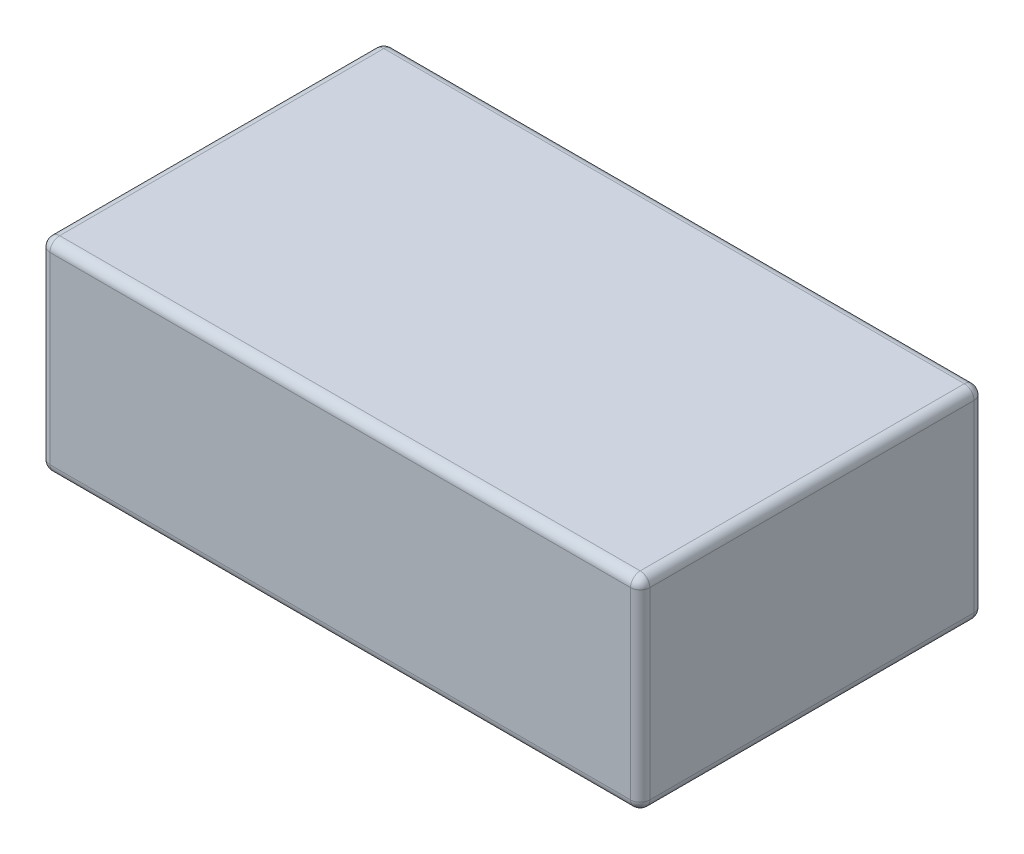
ISO-10303-21;
HEADER;
FILE_DESCRIPTION(('STEP AP214'),'2;1');
FILE_NAME('part.step','',(''),(''),'','','');
FILE_SCHEMA(('AUTOMOTIVE_DESIGN { 1 0 10303 214 1 1 1 1 }'));
ENDSEC;
DATA;
#1=APPLICATION_CONTEXT('core data for automotive mechanical design processes');
#2=APPLICATION_PROTOCOL_DEFINITION('international standard','automotive_design',2000,#1);
#3=PRODUCT_CONTEXT('',#1,'mechanical');
#4=PRODUCT('Part','Part','',(#3));
#5=PRODUCT_RELATED_PRODUCT_CATEGORY('part','',(#4));
#6=PRODUCT_DEFINITION_FORMATION('','',#4);
#7=PRODUCT_DEFINITION_CONTEXT('part definition',#1,'design');
#8=PRODUCT_DEFINITION('design','',#6,#7);
#9=PRODUCT_DEFINITION_SHAPE('','',#8);
#10=(LENGTH_UNIT() NAMED_UNIT(*) SI_UNIT(.MILLI.,.METRE.));
#11=(NAMED_UNIT(*) PLANE_ANGLE_UNIT() SI_UNIT($,.RADIAN.));
#12=(NAMED_UNIT(*) SI_UNIT($,.STERADIAN.) SOLID_ANGLE_UNIT());
#13=UNCERTAINTY_MEASURE_WITH_UNIT(LENGTH_MEASURE(1.E-05),#10,'distance_accuracy_value','');
#14=(GEOMETRIC_REPRESENTATION_CONTEXT(3) GLOBAL_UNCERTAINTY_ASSIGNED_CONTEXT((#13)) GLOBAL_UNIT_ASSIGNED_CONTEXT((#10,
#11,#12)) REPRESENTATION_CONTEXT('',''));
#15=CARTESIAN_POINT('',(0.,0.,0.));
#16=DIRECTION('',(0.,0.,1.));
#17=DIRECTION('',(1.,0.,0.));
#18=AXIS2_PLACEMENT_3D('',#15,#16,#17);
#19=CARTESIAN_POINT('',(-62.,42.,35.5));
#20=DIRECTION('',(1.,0.,0.));
#21=DIRECTION('',(0.,0.,-1.));
#22=AXIS2_PLACEMENT_3D('',#19,#20,#21);
#23=PLANE('',#22);
#24=DIRECTION('',(0.,-1.,0.));
#25=VECTOR('',#24,1.);
#26=CARTESIAN_POINT('',(-62.,42.,-33.5));
#27=LINE('',#26,#25);
#28=CARTESIAN_POINT('',(-62.,40.,-33.5));
#29=VERTEX_POINT('',#28);
#30=CARTESIAN_POINT('',(-62.,2.,-33.5));
#31=VERTEX_POINT('',#30);
#32=EDGE_CURVE('E164',#29,#31,#27,.T.);
#33=ORIENTED_EDGE('',*,*,#32,.T.);
#34=DIRECTION('',(0.,0.,1.));
#35=VECTOR('',#34,1.);
#36=CARTESIAN_POINT('',(-62.,2.,35.5));
#37=LINE('',#36,#35);
#38=CARTESIAN_POINT('',(-62.,2.,33.5));
#39=VERTEX_POINT('',#38);
#40=EDGE_CURVE('E138',#31,#39,#37,.T.);
#41=ORIENTED_EDGE('',*,*,#40,.T.);
#42=DIRECTION('',(0.,-1.,0.));
#43=VECTOR('',#42,1.);
#44=CARTESIAN_POINT('',(-62.,42.,33.5));
#45=LINE('',#44,#43);
#46=CARTESIAN_POINT('',(-62.,40.,33.5));
#47=VERTEX_POINT('',#46);
#48=EDGE_CURVE('E154',#39,#47,#45,.F.);
#49=ORIENTED_EDGE('',*,*,#48,.T.);
#50=DIRECTION('',(0.,0.,1.));
#51=VECTOR('',#50,1.);
#52=CARTESIAN_POINT('',(-62.,40.,-35.5));
#53=LINE('',#52,#51);
#54=EDGE_CURVE('E161',#47,#29,#53,.F.);
#55=ORIENTED_EDGE('',*,*,#54,.T.);
#56=EDGE_LOOP('',(#33,#41,#49,#55));
#57=FACE_BOUND('',#56,.T.);
#58=ADVANCED_FACE('F41',(#57),#23,.F.);
#59=CARTESIAN_POINT('',(62.,42.,35.5));
#60=DIRECTION('',(0.,0.,-1.));
#61=DIRECTION('',(-1.,0.,0.));
#62=AXIS2_PLACEMENT_3D('',#59,#60,#61);
#63=PLANE('',#62);
#64=DIRECTION('',(1.,0.,0.));
#65=VECTOR('',#64,1.);
#66=CARTESIAN_POINT('',(-62.,40.,35.5));
#67=LINE('',#66,#65);
#68=CARTESIAN_POINT('',(60.,40.,35.5));
#69=VERTEX_POINT('',#68);
#70=CARTESIAN_POINT('',(-60.,40.,35.5));
#71=VERTEX_POINT('',#70);
#72=EDGE_CURVE('E66',#69,#71,#67,.F.);
#73=ORIENTED_EDGE('',*,*,#72,.T.);
#74=DIRECTION('',(0.,-1.,0.));
#75=VECTOR('',#74,1.);
#76=CARTESIAN_POINT('',(-60.,42.,35.5));
#77=LINE('',#76,#75);
#78=CARTESIAN_POINT('',(-60.,2.,35.5));
#79=VERTEX_POINT('',#78);
#80=EDGE_CURVE('E11',#71,#79,#77,.T.);
#81=ORIENTED_EDGE('',*,*,#80,.T.);
#82=DIRECTION('',(1.,0.,0.));
#83=VECTOR('',#82,1.);
#84=CARTESIAN_POINT('',(62.,2.,35.5));
#85=LINE('',#84,#83);
#86=CARTESIAN_POINT('',(60.,2.,35.5));
#87=VERTEX_POINT('',#86);
#88=EDGE_CURVE('E51',#79,#87,#85,.T.);
#89=ORIENTED_EDGE('',*,*,#88,.T.);
#90=DIRECTION('',(0.,-1.,0.));
#91=VECTOR('',#90,1.);
#92=CARTESIAN_POINT('',(60.,42.,35.5));
#93=LINE('',#92,#91);
#94=EDGE_CURVE('E222',#87,#69,#93,.F.);
#95=ORIENTED_EDGE('',*,*,#94,.T.);
#96=EDGE_LOOP('',(#73,#81,#89,#95));
#97=FACE_BOUND('',#96,.T.);
#98=ADVANCED_FACE('F363',(#97),#63,.F.);
#99=CARTESIAN_POINT('',(62.,42.,35.5));
#100=DIRECTION('',(-1.,0.,0.));
#101=DIRECTION('',(0.,0.,1.));
#102=AXIS2_PLACEMENT_3D('',#99,#100,#101);
#103=PLANE('',#102);
#104=DIRECTION('',(0.,0.,-1.));
#105=VECTOR('',#104,1.);
#106=CARTESIAN_POINT('',(62.,2.,35.5));
#107=LINE('',#106,#105);
#108=CARTESIAN_POINT('',(62.,2.,33.5));
#109=VERTEX_POINT('',#108);
#110=CARTESIAN_POINT('',(62.,2.,-33.5));
#111=VERTEX_POINT('',#110);
#112=EDGE_CURVE('E202',#109,#111,#107,.T.);
#113=ORIENTED_EDGE('',*,*,#112,.T.);
#114=DIRECTION('',(0.,-1.,0.));
#115=VECTOR('',#114,1.);
#116=CARTESIAN_POINT('',(62.,42.,-33.5));
#117=LINE('',#116,#115);
#118=CARTESIAN_POINT('',(62.,40.,-33.5));
#119=VERTEX_POINT('',#118);
#120=EDGE_CURVE('E205',#111,#119,#117,.F.);
#121=ORIENTED_EDGE('',*,*,#120,.T.);
#122=DIRECTION('',(0.,0.,-1.));
#123=VECTOR('',#122,1.);
#124=CARTESIAN_POINT('',(62.,40.,35.5));
#125=LINE('',#124,#123);
#126=CARTESIAN_POINT('',(62.,40.,33.5));
#127=VERTEX_POINT('',#126);
#128=EDGE_CURVE('E199',#119,#127,#125,.F.);
#129=ORIENTED_EDGE('',*,*,#128,.T.);
#130=DIRECTION('',(0.,-1.,0.));
#131=VECTOR('',#130,1.);
#132=CARTESIAN_POINT('',(62.,42.,33.5));
#133=LINE('',#132,#131);
#134=EDGE_CURVE('E196',#127,#109,#133,.T.);
#135=ORIENTED_EDGE('',*,*,#134,.T.);
#136=EDGE_LOOP('',(#113,#121,#129,#135));
#137=FACE_BOUND('',#136,.T.);
#138=ADVANCED_FACE('F319',(#137),#103,.F.);
#139=CARTESIAN_POINT('',(62.,42.,-35.5));
#140=DIRECTION('',(0.,0.,1.));
#141=DIRECTION('',(1.,0.,0.));
#142=AXIS2_PLACEMENT_3D('',#139,#140,#141);
#143=PLANE('',#142);
#144=DIRECTION('',(-1.,0.,0.));
#145=VECTOR('',#144,1.);
#146=CARTESIAN_POINT('',(62.,2.,-35.5));
#147=LINE('',#146,#145);
#148=CARTESIAN_POINT('',(60.,2.,-35.5));
#149=VERTEX_POINT('',#148);
#150=CARTESIAN_POINT('',(-60.,2.,-35.5));
#151=VERTEX_POINT('',#150);
#152=EDGE_CURVE('E189',#149,#151,#147,.T.);
#153=ORIENTED_EDGE('',*,*,#152,.T.);
#154=DIRECTION('',(0.,-1.,0.));
#155=VECTOR('',#154,1.);
#156=CARTESIAN_POINT('',(-60.,42.,-35.5));
#157=LINE('',#156,#155);
#158=CARTESIAN_POINT('',(-60.,40.,-35.5));
#159=VERTEX_POINT('',#158);
#160=EDGE_CURVE('E192',#151,#159,#157,.F.);
#161=ORIENTED_EDGE('',*,*,#160,.T.);
#162=DIRECTION('',(-1.,0.,0.));
#163=VECTOR('',#162,1.);
#164=CARTESIAN_POINT('',(62.,40.,-35.5));
#165=LINE('',#164,#163);
#166=CARTESIAN_POINT('',(60.,40.,-35.5));
#167=VERTEX_POINT('',#166);
#168=EDGE_CURVE('E183',#159,#167,#165,.F.);
#169=ORIENTED_EDGE('',*,*,#168,.T.);
#170=DIRECTION('',(0.,-1.,0.));
#171=VECTOR('',#170,1.);
#172=CARTESIAN_POINT('',(60.,42.,-35.5));
#173=LINE('',#172,#171);
#174=EDGE_CURVE('E186',#167,#149,#173,.T.);
#175=ORIENTED_EDGE('',*,*,#174,.T.);
#176=EDGE_LOOP('',(#153,#161,#169,#175));
#177=FACE_BOUND('',#176,.T.);
#178=ADVANCED_FACE('F340',(#177),#143,.F.);
#179=CARTESIAN_POINT('',(0.,42.,0.));
#180=DIRECTION('',(0.,1.,0.));
#181=DIRECTION('',(0.,0.,1.));
#182=AXIS2_PLACEMENT_3D('',#179,#180,#181);
#183=PLANE('',#182);
#184=DIRECTION('',(0.,0.,-1.));
#185=VECTOR('',#184,1.);
#186=CARTESIAN_POINT('',(60.,42.,-35.5));
#187=LINE('',#186,#185);
#188=CARTESIAN_POINT('',(60.,42.,33.5));
#189=VERTEX_POINT('',#188);
#190=CARTESIAN_POINT('',(60.,42.,-33.5));
#191=VERTEX_POINT('',#190);
#192=EDGE_CURVE('E209',#189,#191,#187,.T.);
#193=ORIENTED_EDGE('',*,*,#192,.T.);
#194=DIRECTION('',(-1.,0.,0.));
#195=VECTOR('',#194,1.);
#196=CARTESIAN_POINT('',(-62.,42.,-33.5));
#197=LINE('',#196,#195);
#198=CARTESIAN_POINT('',(-60.,42.,-33.5));
#199=VERTEX_POINT('',#198);
#200=EDGE_CURVE('E218',#191,#199,#197,.T.);
#201=ORIENTED_EDGE('',*,*,#200,.T.);
#202=DIRECTION('',(0.,0.,1.));
#203=VECTOR('',#202,1.);
#204=CARTESIAN_POINT('',(-60.,42.,35.5));
#205=LINE('',#204,#203);
#206=CARTESIAN_POINT('',(-60.,42.,33.5));
#207=VERTEX_POINT('',#206);
#208=EDGE_CURVE('E215',#199,#207,#205,.T.);
#209=ORIENTED_EDGE('',*,*,#208,.T.);
#210=DIRECTION('',(1.,0.,0.));
#211=VECTOR('',#210,1.);
#212=CARTESIAN_POINT('',(62.,42.,33.5));
#213=LINE('',#212,#211);
#214=EDGE_CURVE('E212',#207,#189,#213,.T.);
#215=ORIENTED_EDGE('',*,*,#214,.T.);
#216=EDGE_LOOP('',(#193,#201,#209,#215));
#217=FACE_BOUND('',#216,.T.);
#218=ADVANCED_FACE('F354',(#217),#183,.T.);
#219=CARTESIAN_POINT('',(0.,0.,0.));
#220=DIRECTION('',(0.,1.,0.));
#221=DIRECTION('',(0.,0.,1.));
#222=AXIS2_PLACEMENT_3D('',#219,#220,#221);
#223=PLANE('',#222);
#224=DIRECTION('',(1.,0.,0.));
#225=VECTOR('',#224,1.);
#226=CARTESIAN_POINT('',(0.,0.,33.5));
#227=LINE('',#226,#225);
#228=CARTESIAN_POINT('',(60.,0.,33.5));
#229=VERTEX_POINT('',#228);
#230=CARTESIAN_POINT('',(-60.,0.,33.5));
#231=VERTEX_POINT('',#230);
#232=EDGE_CURVE('E167',#229,#231,#227,.F.);
#233=ORIENTED_EDGE('',*,*,#232,.T.);
#234=DIRECTION('',(0.,0.,1.));
#235=VECTOR('',#234,1.);
#236=CARTESIAN_POINT('',(-60.,0.,0.));
#237=LINE('',#236,#235);
#238=CARTESIAN_POINT('',(-60.,0.,-33.5));
#239=VERTEX_POINT('',#238);
#240=EDGE_CURVE('E140',#231,#239,#237,.F.);
#241=ORIENTED_EDGE('',*,*,#240,.T.);
#242=DIRECTION('',(-1.,0.,0.));
#243=VECTOR('',#242,1.);
#244=CARTESIAN_POINT('',(0.,0.,-33.5));
#245=LINE('',#244,#243);
#246=CARTESIAN_POINT('',(60.,0.,-33.5));
#247=VERTEX_POINT('',#246);
#248=EDGE_CURVE('E178',#239,#247,#245,.F.);
#249=ORIENTED_EDGE('',*,*,#248,.T.);
#250=DIRECTION('',(0.,0.,-1.));
#251=VECTOR('',#250,1.);
#252=CARTESIAN_POINT('',(60.,0.,0.));
#253=LINE('',#252,#251);
#254=EDGE_CURVE('E171',#247,#229,#253,.F.);
#255=ORIENTED_EDGE('',*,*,#254,.T.);
#256=EDGE_LOOP('',(#233,#241,#249,#255));
#257=FACE_BOUND('',#256,.T.);
#258=ADVANCED_FACE('F375',(#257),#223,.F.);
#259=CARTESIAN_POINT('',(60.,40.,0.));
#260=DIRECTION('',(0.,0.,1.));
#261=DIRECTION('',(1.,0.,0.));
#262=AXIS2_PLACEMENT_3D('',#259,#260,#261);
#263=CYLINDRICAL_SURFACE('',#262,2.);
#264=CARTESIAN_POINT('',(60.,40.,-33.5));
#265=DIRECTION('',(0.,0.,-1.));
#266=DIRECTION('',(-1.,0.,0.));
#267=AXIS2_PLACEMENT_3D('',#264,#265,#266);
#268=CIRCLE('',#267,2.);
#269=EDGE_CURVE('E45',#191,#119,#268,.T.);
#270=ORIENTED_EDGE('',*,*,#269,.F.);
#271=ORIENTED_EDGE('',*,*,#192,.F.);
#272=CARTESIAN_POINT('',(60.,40.,33.5));
#273=DIRECTION('',(0.,0.,1.));
#274=DIRECTION('',(1.,0.,0.));
#275=AXIS2_PLACEMENT_3D('',#272,#273,#274);
#276=CIRCLE('',#275,2.);
#277=EDGE_CURVE('E298',#127,#189,#276,.T.);
#278=ORIENTED_EDGE('',*,*,#277,.F.);
#279=ORIENTED_EDGE('',*,*,#128,.F.);
#280=EDGE_LOOP('',(#270,#271,#278,#279));
#281=FACE_BOUND('',#280,.T.);
#282=ADVANCED_FACE('F43',(#281),#263,.T.);
#283=CARTESIAN_POINT('',(60.,40.,-33.5));
#284=DIRECTION('',(0.,0.,1.));
#285=DIRECTION('',(1.,0.,0.));
#286=AXIS2_PLACEMENT_3D('',#283,#284,#285);
#287=SPHERICAL_SURFACE('',#286,2.);
#288=CARTESIAN_POINT('',(60.,40.,-33.5));
#289=DIRECTION('',(1.,0.,0.));
#290=DIRECTION('',(0.,0.,-1.));
#291=AXIS2_PLACEMENT_3D('',#288,#289,#290);
#292=CIRCLE('',#291,2.);
#293=EDGE_CURVE('E292',#191,#167,#292,.F.);
#294=ORIENTED_EDGE('',*,*,#293,.F.);
#295=ORIENTED_EDGE('',*,*,#269,.T.);
#296=CARTESIAN_POINT('',(60.,40.,-33.5));
#297=DIRECTION('',(0.,1.,0.));
#298=DIRECTION('',(0.,0.,1.));
#299=AXIS2_PLACEMENT_3D('',#296,#297,#298);
#300=CIRCLE('',#299,2.);
#301=EDGE_CURVE('E296',#167,#119,#300,.F.);
#302=ORIENTED_EDGE('',*,*,#301,.F.);
#303=EDGE_LOOP('',(#294,#295,#302));
#304=FACE_BOUND('',#303,.T.);
#305=ADVANCED_FACE('F312',(#304),#287,.T.);
#306=CARTESIAN_POINT('',(60.,40.,33.5));
#307=DIRECTION('',(0.,0.,1.));
#308=DIRECTION('',(1.,0.,0.));
#309=AXIS2_PLACEMENT_3D('',#306,#307,#308);
#310=SPHERICAL_SURFACE('',#309,2.);
#311=CARTESIAN_POINT('',(60.,40.,33.5));
#312=DIRECTION('',(0.,1.,0.));
#313=DIRECTION('',(0.,0.,1.));
#314=AXIS2_PLACEMENT_3D('',#311,#312,#313);
#315=CIRCLE('',#314,2.);
#316=EDGE_CURVE('E284',#127,#69,#315,.F.);
#317=ORIENTED_EDGE('',*,*,#316,.F.);
#318=ORIENTED_EDGE('',*,*,#277,.T.);
#319=CARTESIAN_POINT('',(60.,40.,33.5));
#320=DIRECTION('',(1.,0.,0.));
#321=DIRECTION('',(0.,0.,-1.));
#322=AXIS2_PLACEMENT_3D('',#319,#320,#321);
#323=CIRCLE('',#322,2.);
#324=EDGE_CURVE('E288',#69,#189,#323,.F.);
#325=ORIENTED_EDGE('',*,*,#324,.F.);
#326=EDGE_LOOP('',(#317,#318,#325));
#327=FACE_BOUND('',#326,.T.);
#328=ADVANCED_FACE('F428',(#327),#310,.T.);
#329=CARTESIAN_POINT('',(60.,42.,-33.5));
#330=DIRECTION('',(0.,-1.,0.));
#331=DIRECTION('',(0.,0.,-1.));
#332=AXIS2_PLACEMENT_3D('',#329,#330,#331);
#333=CYLINDRICAL_SURFACE('',#332,2.);
#334=ORIENTED_EDGE('',*,*,#301,.T.);
#335=ORIENTED_EDGE('',*,*,#120,.F.);
#336=CARTESIAN_POINT('',(60.,2.,-33.5));
#337=DIRECTION('',(0.,-1.,0.));
#338=DIRECTION('',(0.,0.,-1.));
#339=AXIS2_PLACEMENT_3D('',#336,#337,#338);
#340=CIRCLE('',#339,2.);
#341=EDGE_CURVE('E276',#149,#111,#340,.T.);
#342=ORIENTED_EDGE('',*,*,#341,.F.);
#343=ORIENTED_EDGE('',*,*,#174,.F.);
#344=EDGE_LOOP('',(#334,#335,#342,#343));
#345=FACE_BOUND('',#344,.T.);
#346=ADVANCED_FACE('F324',(#345),#333,.T.);
#347=CARTESIAN_POINT('',(0.,40.,-33.5));
#348=DIRECTION('',(1.,0.,0.));
#349=DIRECTION('',(0.,0.,-1.));
#350=AXIS2_PLACEMENT_3D('',#347,#348,#349);
#351=CYLINDRICAL_SURFACE('',#350,2.);
#352=ORIENTED_EDGE('',*,*,#293,.T.);
#353=ORIENTED_EDGE('',*,*,#168,.F.);
#354=CARTESIAN_POINT('',(-60.,40.,-33.5));
#355=DIRECTION('',(-1.,0.,0.));
#356=DIRECTION('',(0.,0.,1.));
#357=AXIS2_PLACEMENT_3D('',#354,#355,#356);
#358=CIRCLE('',#357,2.);
#359=EDGE_CURVE('E272',#199,#159,#358,.T.);
#360=ORIENTED_EDGE('',*,*,#359,.F.);
#361=ORIENTED_EDGE('',*,*,#200,.F.);
#362=EDGE_LOOP('',(#352,#353,#360,#361));
#363=FACE_BOUND('',#362,.T.);
#364=ADVANCED_FACE('F352',(#363),#351,.T.);
#365=CARTESIAN_POINT('',(-60.,40.,0.));
#366=DIRECTION('',(0.,0.,-1.));
#367=DIRECTION('',(-1.,0.,0.));
#368=AXIS2_PLACEMENT_3D('',#365,#366,#367);
#369=CYLINDRICAL_SURFACE('',#368,2.);
#370=CARTESIAN_POINT('',(-60.,40.,33.5));
#371=DIRECTION('',(0.,0.,1.));
#372=DIRECTION('',(1.,0.,0.));
#373=AXIS2_PLACEMENT_3D('',#370,#371,#372);
#374=CIRCLE('',#373,2.);
#375=EDGE_CURVE('E265',#207,#47,#374,.T.);
#376=ORIENTED_EDGE('',*,*,#375,.F.);
#377=ORIENTED_EDGE('',*,*,#208,.F.);
#378=CARTESIAN_POINT('',(-60.,40.,-33.5));
#379=DIRECTION('',(0.,0.,-1.));
#380=DIRECTION('',(0.,1.,0.));
#381=AXIS2_PLACEMENT_3D('',#378,#379,#380);
#382=CIRCLE('',#381,2.);
#383=EDGE_CURVE('E269',#29,#199,#382,.T.);
#384=ORIENTED_EDGE('',*,*,#383,.F.);
#385=ORIENTED_EDGE('',*,*,#54,.F.);
#386=EDGE_LOOP('',(#376,#377,#384,#385));
#387=FACE_BOUND('',#386,.T.);
#388=ADVANCED_FACE('F360',(#387),#369,.T.);
#389=CARTESIAN_POINT('',(0.,40.,33.5));
#390=DIRECTION('',(-1.,0.,0.));
#391=DIRECTION('',(0.,0.,1.));
#392=AXIS2_PLACEMENT_3D('',#389,#390,#391);
#393=CYLINDRICAL_SURFACE('',#392,2.);
#394=ORIENTED_EDGE('',*,*,#324,.T.);
#395=ORIENTED_EDGE('',*,*,#214,.F.);
#396=CARTESIAN_POINT('',(-60.,40.,33.5));
#397=DIRECTION('',(-1.,0.,0.));
#398=DIRECTION('',(0.,-1.,0.));
#399=AXIS2_PLACEMENT_3D('',#396,#397,#398);
#400=CIRCLE('',#399,2.);
#401=EDGE_CURVE('E261',#71,#207,#400,.T.);
#402=ORIENTED_EDGE('',*,*,#401,.F.);
#403=ORIENTED_EDGE('',*,*,#72,.F.);
#404=EDGE_LOOP('',(#394,#395,#402,#403));
#405=FACE_BOUND('',#404,.T.);
#406=ADVANCED_FACE('F358',(#405),#393,.T.);
#407=CARTESIAN_POINT('',(60.,42.,33.5));
#408=DIRECTION('',(0.,-1.,0.));
#409=DIRECTION('',(0.,0.,-1.));
#410=AXIS2_PLACEMENT_3D('',#407,#408,#409);
#411=CYLINDRICAL_SURFACE('',#410,2.);
#412=ORIENTED_EDGE('',*,*,#316,.T.);
#413=ORIENTED_EDGE('',*,*,#94,.F.);
#414=CARTESIAN_POINT('',(60.,2.,33.5));
#415=DIRECTION('',(0.,-1.,0.));
#416=DIRECTION('',(0.,0.,-1.));
#417=AXIS2_PLACEMENT_3D('',#414,#415,#416);
#418=CIRCLE('',#417,2.);
#419=EDGE_CURVE('E257',#109,#87,#418,.T.);
#420=ORIENTED_EDGE('',*,*,#419,.F.);
#421=ORIENTED_EDGE('',*,*,#134,.F.);
#422=EDGE_LOOP('',(#412,#413,#420,#421));
#423=FACE_BOUND('',#422,.T.);
#424=ADVANCED_FACE('F367',(#423),#411,.T.);
#425=CARTESIAN_POINT('',(60.,2.,35.5));
#426=DIRECTION('',(0.,0.,-1.));
#427=DIRECTION('',(-1.,0.,0.));
#428=AXIS2_PLACEMENT_3D('',#425,#426,#427);
#429=CYLINDRICAL_SURFACE('',#428,2.);
#430=CARTESIAN_POINT('',(60.,2.,-33.5));
#431=DIRECTION('',(0.,0.,-1.));
#432=DIRECTION('',(-1.,0.,0.));
#433=AXIS2_PLACEMENT_3D('',#430,#431,#432);
#434=CIRCLE('',#433,2.);
#435=EDGE_CURVE('E280',#111,#247,#434,.T.);
#436=ORIENTED_EDGE('',*,*,#435,.F.);
#437=ORIENTED_EDGE('',*,*,#112,.F.);
#438=CARTESIAN_POINT('',(60.,2.,33.5));
#439=DIRECTION('',(0.,0.,1.));
#440=DIRECTION('',(1.,0.,0.));
#441=AXIS2_PLACEMENT_3D('',#438,#439,#440);
#442=CIRCLE('',#441,2.);
#443=EDGE_CURVE('E253',#229,#109,#442,.T.);
#444=ORIENTED_EDGE('',*,*,#443,.F.);
#445=ORIENTED_EDGE('',*,*,#254,.F.);
#446=EDGE_LOOP('',(#436,#437,#444,#445));
#447=FACE_BOUND('',#446,.T.);
#448=ADVANCED_FACE('F328',(#447),#429,.T.);
#449=CARTESIAN_POINT('',(60.,2.,-33.5));
#450=DIRECTION('',(0.,0.,1.));
#451=DIRECTION('',(1.,0.,0.));
#452=AXIS2_PLACEMENT_3D('',#449,#450,#451);
#453=SPHERICAL_SURFACE('',#452,2.);
#454=ORIENTED_EDGE('',*,*,#341,.T.);
#455=ORIENTED_EDGE('',*,*,#435,.T.);
#456=CARTESIAN_POINT('',(60.,2.,-33.5));
#457=DIRECTION('',(1.,0.,0.));
#458=DIRECTION('',(0.,0.,-1.));
#459=AXIS2_PLACEMENT_3D('',#456,#457,#458);
#460=CIRCLE('',#459,2.);
#461=EDGE_CURVE('E249',#149,#247,#460,.F.);
#462=ORIENTED_EDGE('',*,*,#461,.F.);
#463=EDGE_LOOP('',(#454,#455,#462));
#464=FACE_BOUND('',#463,.T.);
#465=ADVANCED_FACE('F332',(#464),#453,.T.);
#466=CARTESIAN_POINT('',(-60.,40.,-33.5));
#467=DIRECTION('',(0.,0.,1.));
#468=DIRECTION('',(1.,0.,0.));
#469=AXIS2_PLACEMENT_3D('',#466,#467,#468);
#470=SPHERICAL_SURFACE('',#469,2.);
#471=ORIENTED_EDGE('',*,*,#383,.T.);
#472=ORIENTED_EDGE('',*,*,#359,.T.);
#473=CARTESIAN_POINT('',(-60.,40.,-33.5));
#474=DIRECTION('',(0.,1.,0.));
#475=DIRECTION('',(0.,0.,1.));
#476=AXIS2_PLACEMENT_3D('',#473,#474,#475);
#477=CIRCLE('',#476,2.);
#478=EDGE_CURVE('E246',#29,#159,#477,.F.);
#479=ORIENTED_EDGE('',*,*,#478,.F.);
#480=EDGE_LOOP('',(#471,#472,#479));
#481=FACE_BOUND('',#480,.T.);
#482=ADVANCED_FACE('F348',(#481),#470,.T.);
#483=CARTESIAN_POINT('',(-60.,40.,33.5));
#484=DIRECTION('',(0.,0.,1.));
#485=DIRECTION('',(1.,0.,0.));
#486=AXIS2_PLACEMENT_3D('',#483,#484,#485);
#487=SPHERICAL_SURFACE('',#486,2.);
#488=ORIENTED_EDGE('',*,*,#401,.T.);
#489=ORIENTED_EDGE('',*,*,#375,.T.);
#490=CARTESIAN_POINT('',(-60.,40.,33.5));
#491=DIRECTION('',(0.,1.,0.));
#492=DIRECTION('',(0.,0.,1.));
#493=AXIS2_PLACEMENT_3D('',#490,#491,#492);
#494=CIRCLE('',#493,2.);
#495=EDGE_CURVE('E157',#71,#47,#494,.F.);
#496=ORIENTED_EDGE('',*,*,#495,.F.);
#497=EDGE_LOOP('',(#488,#489,#496));
#498=FACE_BOUND('',#497,.T.);
#499=ADVANCED_FACE('F362',(#498),#487,.T.);
#500=CARTESIAN_POINT('',(60.,2.,33.5));
#501=DIRECTION('',(0.,0.,1.));
#502=DIRECTION('',(1.,0.,0.));
#503=AXIS2_PLACEMENT_3D('',#500,#501,#502);
#504=SPHERICAL_SURFACE('',#503,2.);
#505=ORIENTED_EDGE('',*,*,#443,.T.);
#506=ORIENTED_EDGE('',*,*,#419,.T.);
#507=CARTESIAN_POINT('',(60.,2.,33.5));
#508=DIRECTION('',(1.,0.,0.));
#509=DIRECTION('',(0.,0.,-1.));
#510=AXIS2_PLACEMENT_3D('',#507,#508,#509);
#511=CIRCLE('',#510,2.);
#512=EDGE_CURVE('E240',#229,#87,#511,.F.);
#513=ORIENTED_EDGE('',*,*,#512,.F.);
#514=EDGE_LOOP('',(#505,#506,#513));
#515=FACE_BOUND('',#514,.T.);
#516=ADVANCED_FACE('F371',(#515),#504,.T.);
#517=CARTESIAN_POINT('',(62.,2.,-33.5));
#518=DIRECTION('',(-1.,0.,0.));
#519=DIRECTION('',(0.,0.,1.));
#520=AXIS2_PLACEMENT_3D('',#517,#518,#519);
#521=CYLINDRICAL_SURFACE('',#520,2.);
#522=ORIENTED_EDGE('',*,*,#461,.T.);
#523=ORIENTED_EDGE('',*,*,#248,.F.);
#524=CARTESIAN_POINT('',(-60.,2.,-33.5));
#525=DIRECTION('',(-1.,0.,0.));
#526=DIRECTION('',(0.,0.,1.));
#527=AXIS2_PLACEMENT_3D('',#524,#525,#526);
#528=CIRCLE('',#527,2.);
#529=EDGE_CURVE('E236',#151,#239,#528,.T.);
#530=ORIENTED_EDGE('',*,*,#529,.F.);
#531=ORIENTED_EDGE('',*,*,#152,.F.);
#532=EDGE_LOOP('',(#522,#523,#530,#531));
#533=FACE_BOUND('',#532,.T.);
#534=ADVANCED_FACE('F337',(#533),#521,.T.);
#535=CARTESIAN_POINT('',(-60.,42.,-33.5));
#536=DIRECTION('',(0.,-1.,0.));
#537=DIRECTION('',(0.,0.,-1.));
#538=AXIS2_PLACEMENT_3D('',#535,#536,#537);
#539=CYLINDRICAL_SURFACE('',#538,2.);
#540=ORIENTED_EDGE('',*,*,#478,.T.);
#541=ORIENTED_EDGE('',*,*,#160,.F.);
#542=CARTESIAN_POINT('',(-60.,2.,-33.5));
#543=DIRECTION('',(0.,-1.,0.));
#544=DIRECTION('',(0.,0.,-1.));
#545=AXIS2_PLACEMENT_3D('',#542,#543,#544);
#546=CIRCLE('',#545,2.);
#547=EDGE_CURVE('E151',#31,#151,#546,.T.);
#548=ORIENTED_EDGE('',*,*,#547,.F.);
#549=ORIENTED_EDGE('',*,*,#32,.F.);
#550=EDGE_LOOP('',(#540,#541,#548,#549));
#551=FACE_BOUND('',#550,.T.);
#552=ADVANCED_FACE('F342',(#551),#539,.T.);
#553=CARTESIAN_POINT('',(-60.,42.,33.5));
#554=DIRECTION('',(0.,-1.,0.));
#555=DIRECTION('',(0.,0.,-1.));
#556=AXIS2_PLACEMENT_3D('',#553,#554,#555);
#557=CYLINDRICAL_SURFACE('',#556,2.);
#558=ORIENTED_EDGE('',*,*,#495,.T.);
#559=ORIENTED_EDGE('',*,*,#48,.F.);
#560=CARTESIAN_POINT('',(-60.,2.,33.5));
#561=DIRECTION('',(0.,-1.,0.));
#562=DIRECTION('',(0.,0.,-1.));
#563=AXIS2_PLACEMENT_3D('',#560,#561,#562);
#564=CIRCLE('',#563,2.);
#565=EDGE_CURVE('E144',#79,#39,#564,.T.);
#566=ORIENTED_EDGE('',*,*,#565,.F.);
#567=ORIENTED_EDGE('',*,*,#80,.F.);
#568=EDGE_LOOP('',(#558,#559,#566,#567));
#569=FACE_BOUND('',#568,.T.);
#570=ADVANCED_FACE('F155',(#569),#557,.T.);
#571=CARTESIAN_POINT('',(62.,2.,33.5));
#572=DIRECTION('',(1.,0.,0.));
#573=DIRECTION('',(0.,0.,-1.));
#574=AXIS2_PLACEMENT_3D('',#571,#572,#573);
#575=CYLINDRICAL_SURFACE('',#574,2.);
#576=ORIENTED_EDGE('',*,*,#512,.T.);
#577=ORIENTED_EDGE('',*,*,#88,.F.);
#578=CARTESIAN_POINT('',(-60.,2.,33.5));
#579=DIRECTION('',(-1.,0.,0.));
#580=DIRECTION('',(0.,0.,1.));
#581=AXIS2_PLACEMENT_3D('',#578,#579,#580);
#582=CIRCLE('',#581,2.);
#583=EDGE_CURVE('E59',#231,#79,#582,.T.);
#584=ORIENTED_EDGE('',*,*,#583,.F.);
#585=ORIENTED_EDGE('',*,*,#232,.F.);
#586=EDGE_LOOP('',(#576,#577,#584,#585));
#587=FACE_BOUND('',#586,.T.);
#588=ADVANCED_FACE('F373',(#587),#575,.T.);
#589=CARTESIAN_POINT('',(-60.,2.,-33.5));
#590=DIRECTION('',(0.,0.,1.));
#591=DIRECTION('',(1.,0.,0.));
#592=AXIS2_PLACEMENT_3D('',#589,#590,#591);
#593=SPHERICAL_SURFACE('',#592,2.);
#594=ORIENTED_EDGE('',*,*,#547,.T.);
#595=ORIENTED_EDGE('',*,*,#529,.T.);
#596=CARTESIAN_POINT('',(-60.,2.,-33.5));
#597=DIRECTION('',(0.,0.,-1.));
#598=DIRECTION('',(-1.,0.,0.));
#599=AXIS2_PLACEMENT_3D('',#596,#597,#598);
#600=CIRCLE('',#599,2.);
#601=EDGE_CURVE('E142',#31,#239,#600,.F.);
#602=ORIENTED_EDGE('',*,*,#601,.F.);
#603=EDGE_LOOP('',(#594,#595,#602));
#604=FACE_BOUND('',#603,.T.);
#605=ADVANCED_FACE('F396',(#604),#593,.T.);
#606=CARTESIAN_POINT('',(-60.,2.,33.5));
#607=DIRECTION('',(0.,0.,1.));
#608=DIRECTION('',(1.,0.,0.));
#609=AXIS2_PLACEMENT_3D('',#606,#607,#608);
#610=SPHERICAL_SURFACE('',#609,2.);
#611=ORIENTED_EDGE('',*,*,#583,.T.);
#612=ORIENTED_EDGE('',*,*,#565,.T.);
#613=CARTESIAN_POINT('',(-60.,2.,33.5));
#614=DIRECTION('',(0.,0.,1.));
#615=DIRECTION('',(1.,0.,0.));
#616=AXIS2_PLACEMENT_3D('',#613,#614,#615);
#617=CIRCLE('',#616,2.);
#618=EDGE_CURVE('E135',#231,#39,#617,.F.);
#619=ORIENTED_EDGE('',*,*,#618,.F.);
#620=EDGE_LOOP('',(#611,#612,#619));
#621=FACE_BOUND('',#620,.T.);
#622=ADVANCED_FACE('F146',(#621),#610,.T.);
#623=CARTESIAN_POINT('',(-60.,2.,35.5));
#624=DIRECTION('',(0.,0.,1.));
#625=DIRECTION('',(1.,0.,0.));
#626=AXIS2_PLACEMENT_3D('',#623,#624,#625);
#627=CYLINDRICAL_SURFACE('',#626,2.);
#628=ORIENTED_EDGE('',*,*,#601,.T.);
#629=ORIENTED_EDGE('',*,*,#240,.F.);
#630=ORIENTED_EDGE('',*,*,#618,.T.);
#631=ORIENTED_EDGE('',*,*,#40,.F.);
#632=EDGE_LOOP('',(#628,#629,#630,#631));
#633=FACE_BOUND('',#632,.T.);
#634=ADVANCED_FACE('F136',(#633),#627,.T.);
#635=CLOSED_SHELL('',(#58,#98,#138,#178,#218,#258,#282,#305,#328,#346,#364,#388,#406,#424,#448,
#465,#482,#499,#516,#534,#552,#570,#588,#605,#622,#634));
#636=MANIFOLD_SOLID_BREP('B2',#635);
#637=ADVANCED_BREP_SHAPE_REPRESENTATION('',(#18,#636),#14);
#638=SHAPE_DEFINITION_REPRESENTATION(#9,#637);
ENDSEC;
END-ISO-10303-21;
